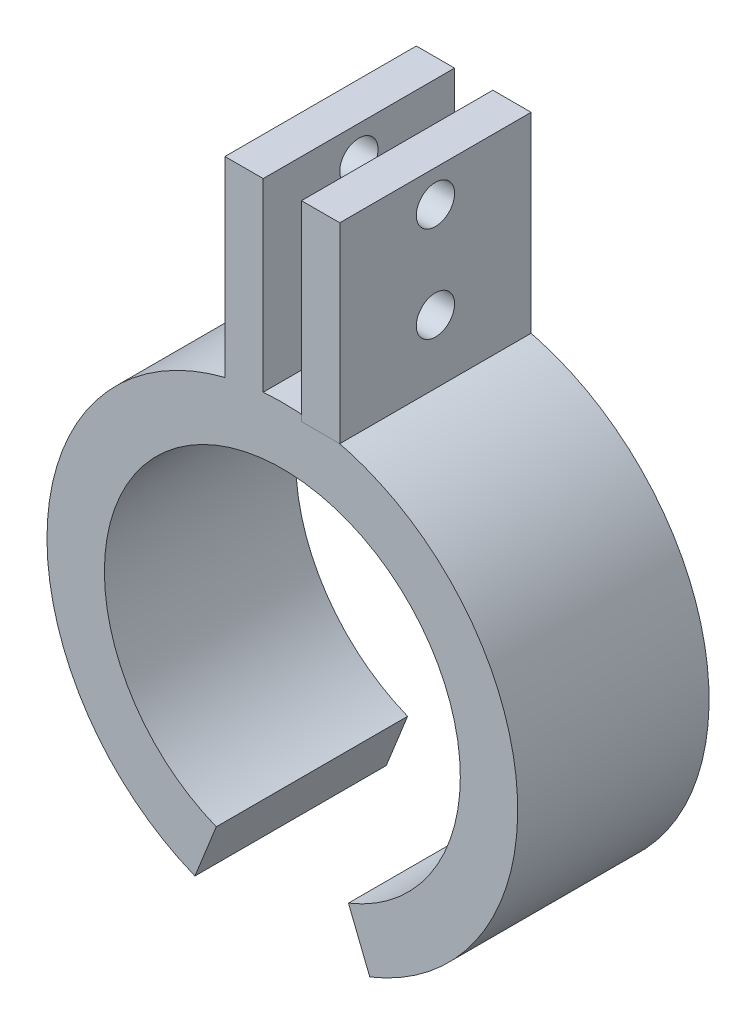
ISO-10303-21;
HEADER;
FILE_DESCRIPTION(('STEP AP214'),'2;1');
FILE_NAME('part.step','',(''),(''),'','','');
FILE_SCHEMA(('AUTOMOTIVE_DESIGN { 1 0 10303 214 1 1 1 1 }'));
ENDSEC;
DATA;
#1=APPLICATION_CONTEXT('core data for automotive mechanical design processes');
#2=APPLICATION_PROTOCOL_DEFINITION('international standard','automotive_design',2000,#1);
#3=PRODUCT_CONTEXT('',#1,'mechanical');
#4=PRODUCT('Part','Part','',(#3));
#5=PRODUCT_RELATED_PRODUCT_CATEGORY('part','',(#4));
#6=PRODUCT_DEFINITION_FORMATION('','',#4);
#7=PRODUCT_DEFINITION_CONTEXT('part definition',#1,'design');
#8=PRODUCT_DEFINITION('design','',#6,#7);
#9=PRODUCT_DEFINITION_SHAPE('','',#8);
#10=(LENGTH_UNIT() NAMED_UNIT(*) SI_UNIT(.MILLI.,.METRE.));
#11=(NAMED_UNIT(*) PLANE_ANGLE_UNIT() SI_UNIT($,.RADIAN.));
#12=(NAMED_UNIT(*) SI_UNIT($,.STERADIAN.) SOLID_ANGLE_UNIT());
#13=UNCERTAINTY_MEASURE_WITH_UNIT(LENGTH_MEASURE(1.E-05),#10,'distance_accuracy_value','');
#14=(GEOMETRIC_REPRESENTATION_CONTEXT(3) GLOBAL_UNCERTAINTY_ASSIGNED_CONTEXT((#13)) GLOBAL_UNIT_ASSIGNED_CONTEXT((#10,
#11,#12)) REPRESENTATION_CONTEXT('',''));
#15=CARTESIAN_POINT('',(0.,0.,0.));
#16=DIRECTION('',(0.,0.,1.));
#17=DIRECTION('',(1.,0.,0.));
#18=AXIS2_PLACEMENT_3D('',#15,#16,#17);
#19=CARTESIAN_POINT('',(3.,11.9285372112426,10.));
#20=DIRECTION('',(-1.,0.,0.));
#21=DIRECTION('',(0.,0.,1.));
#22=AXIS2_PLACEMENT_3D('',#19,#20,#21);
#23=PLANE('',#22);
#24=CARTESIAN_POINT('',(3.,20.259282197584,5.));
#25=DIRECTION('',(-1.,0.,0.));
#26=DIRECTION('',(0.,0.,1.));
#27=AXIS2_PLACEMENT_3D('',#24,#25,#26);
#28=CIRCLE('',#27,1.);
#29=CARTESIAN_POINT('',(3.,20.259282197584,6.));
#30=VERTEX_POINT('',#29);
#31=EDGE_CURVE('E117',#30,#30,#28,.T.);
#32=ORIENTED_EDGE('',*,*,#31,.T.);
#33=EDGE_LOOP('',(#32));
#34=FACE_BOUND('',#33,.T.);
#35=CARTESIAN_POINT('',(3.,15.259282197584,5.));
#36=DIRECTION('',(-1.,0.,0.));
#37=DIRECTION('',(0.,0.,1.));
#38=AXIS2_PLACEMENT_3D('',#35,#36,#37);
#39=CIRCLE('',#38,1.);
#40=CARTESIAN_POINT('',(3.,15.259282197584,6.));
#41=VERTEX_POINT('',#40);
#42=EDGE_CURVE('E127',#41,#41,#39,.T.);
#43=ORIENTED_EDGE('',*,*,#42,.T.);
#44=EDGE_LOOP('',(#43));
#45=FACE_BOUND('',#44,.T.);
#46=DIRECTION('',(0.,1.,0.));
#47=VECTOR('',#46,1.);
#48=CARTESIAN_POINT('',(3.,11.9285372112426,0.));
#49=LINE('',#48,#47);
#50=CARTESIAN_POINT('',(3.,11.9285372112426,0.));
#51=VERTEX_POINT('',#50);
#52=CARTESIAN_POINT('',(3.,21.9285372112426,0.));
#53=VERTEX_POINT('',#52);
#54=EDGE_CURVE('E115',#51,#53,#49,.T.);
#55=ORIENTED_EDGE('',*,*,#54,.T.);
#56=DIRECTION('',(0.,0.,-1.));
#57=VECTOR('',#56,1.);
#58=CARTESIAN_POINT('',(3.,21.9285372112426,10.));
#59=LINE('',#58,#57);
#60=CARTESIAN_POINT('',(3.,21.9285372112426,10.));
#61=VERTEX_POINT('',#60);
#62=EDGE_CURVE('E12',#61,#53,#59,.T.);
#63=ORIENTED_EDGE('',*,*,#62,.F.);
#64=DIRECTION('',(0.,1.,0.));
#65=VECTOR('',#64,1.);
#66=CARTESIAN_POINT('',(3.,11.9285372112426,10.));
#67=LINE('',#66,#65);
#68=CARTESIAN_POINT('',(3.,11.9285372112426,10.));
#69=VERTEX_POINT('',#68);
#70=EDGE_CURVE('E91',#69,#61,#67,.T.);
#71=ORIENTED_EDGE('',*,*,#70,.F.);
#72=DIRECTION('',(0.,0.,-1.));
#73=VECTOR('',#72,1.);
#74=CARTESIAN_POINT('',(3.,11.9285372112426,10.));
#75=LINE('',#74,#73);
#76=EDGE_CURVE('E67',#69,#51,#75,.T.);
#77=ORIENTED_EDGE('',*,*,#76,.T.);
#78=EDGE_LOOP('',(#55,#63,#71,#77));
#79=FACE_BOUND('',#78,.T.);
#80=ADVANCED_FACE('F49',(#34,#45,#79),#23,.F.);
#81=CARTESIAN_POINT('',(1.,21.9285372112426,10.));
#82=DIRECTION('',(0.,1.,0.));
#83=DIRECTION('',(0.,0.,1.));
#84=AXIS2_PLACEMENT_3D('',#81,#82,#83);
#85=PLANE('',#84);
#86=DIRECTION('',(1.,0.,0.));
#87=VECTOR('',#86,1.);
#88=CARTESIAN_POINT('',(1.,21.9285372112426,0.));
#89=LINE('',#88,#87);
#90=CARTESIAN_POINT('',(1.,21.9285372112426,0.));
#91=VERTEX_POINT('',#90);
#92=EDGE_CURVE('E100',#91,#53,#89,.T.);
#93=ORIENTED_EDGE('',*,*,#92,.F.);
#94=DIRECTION('',(0.,0.,-1.));
#95=VECTOR('',#94,1.);
#96=CARTESIAN_POINT('',(1.,21.9285372112426,10.));
#97=LINE('',#96,#95);
#98=CARTESIAN_POINT('',(1.,21.9285372112426,10.));
#99=VERTEX_POINT('',#98);
#100=EDGE_CURVE('E58',#99,#91,#97,.T.);
#101=ORIENTED_EDGE('',*,*,#100,.F.);
#102=DIRECTION('',(1.,0.,0.));
#103=VECTOR('',#102,1.);
#104=CARTESIAN_POINT('',(1.,21.9285372112426,10.));
#105=LINE('',#104,#103);
#106=EDGE_CURVE('E98',#99,#61,#105,.T.);
#107=ORIENTED_EDGE('',*,*,#106,.T.);
#108=ORIENTED_EDGE('',*,*,#62,.T.);
#109=EDGE_LOOP('',(#93,#101,#107,#108));
#110=FACE_BOUND('',#109,.T.);
#111=ADVANCED_FACE('F97',(#110),#85,.T.);
#112=CARTESIAN_POINT('',(1.,11.9285372112426,10.));
#113=DIRECTION('',(-1.,0.,0.));
#114=DIRECTION('',(0.,0.,1.));
#115=AXIS2_PLACEMENT_3D('',#112,#113,#114);
#116=PLANE('',#115);
#117=CARTESIAN_POINT('',(1.,20.259282197584,5.));
#118=DIRECTION('',(-1.,0.,0.));
#119=DIRECTION('',(0.,0.,1.));
#120=AXIS2_PLACEMENT_3D('',#117,#118,#119);
#121=CIRCLE('',#120,1.);
#122=CARTESIAN_POINT('',(1.,20.259282197584,6.));
#123=VERTEX_POINT('',#122);
#124=EDGE_CURVE('E52',#123,#123,#121,.T.);
#125=ORIENTED_EDGE('',*,*,#124,.F.);
#126=EDGE_LOOP('',(#125));
#127=FACE_BOUND('',#126,.T.);
#128=CARTESIAN_POINT('',(1.,15.259282197584,5.));
#129=DIRECTION('',(-1.,0.,0.));
#130=DIRECTION('',(0.,0.,1.));
#131=AXIS2_PLACEMENT_3D('',#128,#129,#130);
#132=CIRCLE('',#131,1.);
#133=CARTESIAN_POINT('',(1.,15.259282197584,6.));
#134=VERTEX_POINT('',#133);
#135=EDGE_CURVE('E125',#134,#134,#132,.T.);
#136=ORIENTED_EDGE('',*,*,#135,.F.);
#137=EDGE_LOOP('',(#136));
#138=FACE_BOUND('',#137,.T.);
#139=DIRECTION('',(0.,1.,0.));
#140=VECTOR('',#139,1.);
#141=CARTESIAN_POINT('',(1.,11.9285372112426,0.));
#142=LINE('',#141,#140);
#143=CARTESIAN_POINT('',(1.,11.9285372112426,0.));
#144=VERTEX_POINT('',#143);
#145=EDGE_CURVE('E119',#144,#91,#142,.T.);
#146=ORIENTED_EDGE('',*,*,#145,.F.);
#147=DIRECTION('',(0.,0.,-1.));
#148=VECTOR('',#147,1.);
#149=CARTESIAN_POINT('',(1.,11.9285372112426,10.));
#150=LINE('',#149,#148);
#151=CARTESIAN_POINT('',(1.,11.9285372112426,10.));
#152=VERTEX_POINT('',#151);
#153=EDGE_CURVE('E80',#152,#144,#150,.T.);
#154=ORIENTED_EDGE('',*,*,#153,.F.);
#155=DIRECTION('',(0.,1.,0.));
#156=VECTOR('',#155,1.);
#157=CARTESIAN_POINT('',(1.,11.9285372112426,10.));
#158=LINE('',#157,#156);
#159=EDGE_CURVE('E107',#152,#99,#158,.T.);
#160=ORIENTED_EDGE('',*,*,#159,.T.);
#161=ORIENTED_EDGE('',*,*,#100,.T.);
#162=EDGE_LOOP('',(#146,#154,#160,#161));
#163=FACE_BOUND('',#162,.T.);
#164=ADVANCED_FACE('F109',(#127,#138,#163),#116,.T.);
#165=CARTESIAN_POINT('',(3.,11.9285372112426,10.));
#166=DIRECTION('',(0.,-1.,0.));
#167=DIRECTION('',(0.,0.,-1.));
#168=AXIS2_PLACEMENT_3D('',#165,#166,#167);
#169=PLANE('',#168);
#170=DIRECTION('',(-1.,0.,0.));
#171=VECTOR('',#170,1.);
#172=CARTESIAN_POINT('',(3.,11.9285372112426,0.));
#173=LINE('',#172,#171);
#174=EDGE_CURVE('E121',#51,#144,#173,.T.);
#175=ORIENTED_EDGE('',*,*,#174,.F.);
#176=ORIENTED_EDGE('',*,*,#76,.F.);
#177=DIRECTION('',(-1.,0.,0.));
#178=VECTOR('',#177,1.);
#179=CARTESIAN_POINT('',(3.,11.9285372112426,10.));
#180=LINE('',#179,#178);
#181=EDGE_CURVE('E110',#69,#152,#180,.T.);
#182=ORIENTED_EDGE('',*,*,#181,.T.);
#183=ORIENTED_EDGE('',*,*,#153,.T.);
#184=EDGE_LOOP('',(#175,#176,#182,#183));
#185=FACE_BOUND('',#184,.T.);
#186=ADVANCED_FACE('F157',(#185),#169,.T.);
#187=CARTESIAN_POINT('',(0.,0.,10.));
#188=DIRECTION('',(0.,0.,-1.));
#189=DIRECTION('',(-1.,0.,0.));
#190=AXIS2_PLACEMENT_3D('',#187,#188,#189);
#191=PLANE('',#190);
#192=ORIENTED_EDGE('',*,*,#70,.T.);
#193=ORIENTED_EDGE('',*,*,#106,.F.);
#194=ORIENTED_EDGE('',*,*,#159,.F.);
#195=ORIENTED_EDGE('',*,*,#181,.F.);
#196=EDGE_LOOP('',(#192,#193,#194,#195));
#197=FACE_BOUND('',#196,.T.);
#198=ADVANCED_FACE('F106',(#197),#191,.F.);
#199=CARTESIAN_POINT('',(0.,0.,0.));
#200=DIRECTION('',(0.,0.,-1.));
#201=DIRECTION('',(-1.,0.,0.));
#202=AXIS2_PLACEMENT_3D('',#199,#200,#201);
#203=PLANE('',#202);
#204=ORIENTED_EDGE('',*,*,#54,.F.);
#205=ORIENTED_EDGE('',*,*,#174,.T.);
#206=ORIENTED_EDGE('',*,*,#145,.T.);
#207=ORIENTED_EDGE('',*,*,#92,.T.);
#208=EDGE_LOOP('',(#204,#205,#206,#207));
#209=FACE_BOUND('',#208,.T.);
#210=ADVANCED_FACE('F148',(#209),#203,.T.);
#211=CARTESIAN_POINT('',(12.3,15.259282197584,5.));
#212=DIRECTION('',(-1.,0.,0.));
#213=DIRECTION('',(0.,0.,1.));
#214=AXIS2_PLACEMENT_3D('',#211,#212,#213);
#215=CYLINDRICAL_SURFACE('',#214,1.);
#216=ORIENTED_EDGE('',*,*,#135,.T.);
#217=EDGE_LOOP('',(#216));
#218=FACE_BOUND('',#217,.T.);
#219=ORIENTED_EDGE('',*,*,#42,.F.);
#220=EDGE_LOOP('',(#219));
#221=FACE_BOUND('',#220,.T.);
#222=ADVANCED_FACE('F142',(#218,#221),#215,.F.);
#223=CARTESIAN_POINT('',(12.3,20.259282197584,5.));
#224=DIRECTION('',(-1.,0.,0.));
#225=DIRECTION('',(0.,0.,1.));
#226=AXIS2_PLACEMENT_3D('',#223,#224,#225);
#227=CYLINDRICAL_SURFACE('',#226,1.);
#228=ORIENTED_EDGE('',*,*,#124,.T.);
#229=EDGE_LOOP('',(#228));
#230=FACE_BOUND('',#229,.T.);
#231=ORIENTED_EDGE('',*,*,#31,.F.);
#232=EDGE_LOOP('',(#231));
#233=FACE_BOUND('',#232,.T.);
#234=ADVANCED_FACE('F140',(#230,#233),#227,.F.);
#235=CLOSED_SHELL('',(#80,#111,#164,#186,#198,#210,#222,#234));
#236=MANIFOLD_SOLID_BREP('B2',#235);
#237=CARTESIAN_POINT('',(0.,0.,10.));
#238=DIRECTION('',(0.,0.,-1.));
#239=DIRECTION('',(-1.,0.,0.));
#240=AXIS2_PLACEMENT_3D('',#237,#238,#239);
#241=CYLINDRICAL_SURFACE('',#240,12.3);
#242=DIRECTION('',(0.,0.,1.));
#243=VECTOR('',#242,1.);
#244=CARTESIAN_POINT('',(-3.,11.9285372112426,0.));
#245=LINE('',#244,#243);
#246=CARTESIAN_POINT('',(-3.,11.9285372112426,0.));
#247=VERTEX_POINT('',#246);
#248=CARTESIAN_POINT('',(-3.,11.9285372112426,10.));
#249=VERTEX_POINT('',#248);
#250=EDGE_CURVE('E319',#247,#249,#245,.T.);
#251=ORIENTED_EDGE('',*,*,#250,.F.);
#252=CARTESIAN_POINT('',(0.,0.,0.));
#253=DIRECTION('',(0.,0.,1.));
#254=DIRECTION('',(1.,0.,0.));
#255=AXIS2_PLACEMENT_3D('',#252,#253,#254);
#256=CIRCLE('',#255,12.3);
#257=CARTESIAN_POINT('',(-4.56810531915548,-11.4202632978887,0.));
#258=VERTEX_POINT('',#257);
#259=EDGE_CURVE('E326',#247,#258,#256,.T.);
#260=ORIENTED_EDGE('',*,*,#259,.T.);
#261=DIRECTION('',(0.,0.,-1.));
#262=VECTOR('',#261,1.);
#263=CARTESIAN_POINT('',(-4.56810531915548,-11.4202632978887,10.));
#264=LINE('',#263,#262);
#265=CARTESIAN_POINT('',(-4.56810531915548,-11.4202632978887,10.));
#266=VERTEX_POINT('',#265);
#267=EDGE_CURVE('E47',#266,#258,#264,.T.);
#268=ORIENTED_EDGE('',*,*,#267,.F.);
#269=CARTESIAN_POINT('',(0.,0.,10.));
#270=DIRECTION('',(0.,0.,1.));
#271=DIRECTION('',(1.,0.,0.));
#272=AXIS2_PLACEMENT_3D('',#269,#270,#271);
#273=CIRCLE('',#272,12.3);
#274=EDGE_CURVE('E266',#249,#266,#273,.T.);
#275=ORIENTED_EDGE('',*,*,#274,.F.);
#276=EDGE_LOOP('',(#251,#260,#268,#275));
#277=FACE_BOUND('',#276,.T.);
#278=ADVANCED_FACE('F215',(#277),#241,.T.);
#279=CARTESIAN_POINT('',(4.56810531915547,-11.4202632978887,0.));
#280=VERTEX_POINT('',#279);
#281=CARTESIAN_POINT('',(-1.,12.259282197584,0.));
#282=VERTEX_POINT('',#281);
#283=EDGE_CURVE('E342',#280,#282,#256,.T.);
#284=ORIENTED_EDGE('',*,*,#283,.T.);
#285=DIRECTION('',(0.,0.,-1.));
#286=VECTOR('',#285,1.);
#287=CARTESIAN_POINT('',(-1.,12.259282197584,10.));
#288=LINE('',#287,#286);
#289=CARTESIAN_POINT('',(-1.,12.259282197584,10.));
#290=VERTEX_POINT('',#289);
#291=EDGE_CURVE('E298',#282,#290,#288,.F.);
#292=ORIENTED_EDGE('',*,*,#291,.T.);
#293=CARTESIAN_POINT('',(4.56810531915547,-11.4202632978887,10.));
#294=VERTEX_POINT('',#293);
#295=EDGE_CURVE('E327',#294,#290,#273,.T.);
#296=ORIENTED_EDGE('',*,*,#295,.F.);
#297=DIRECTION('',(0.,0.,-1.));
#298=VECTOR('',#297,1.);
#299=CARTESIAN_POINT('',(4.56810531915547,-11.4202632978887,10.));
#300=LINE('',#299,#298);
#301=EDGE_CURVE('E242',#294,#280,#300,.T.);
#302=ORIENTED_EDGE('',*,*,#301,.T.);
#303=EDGE_LOOP('',(#284,#292,#296,#302));
#304=FACE_BOUND('',#303,.T.);
#305=ADVANCED_FACE('F217',(#304),#241,.T.);
#306=CARTESIAN_POINT('',(-3.45393329009317,-8.63483322523291,10.));
#307=DIRECTION('',(0.928476690885259,-0.371390676354104,0.));
#308=DIRECTION('',(0.371390676354104,0.928476690885259,0.));
#309=AXIS2_PLACEMENT_3D('',#306,#307,#308);
#310=PLANE('',#309);
#311=DIRECTION('',(-0.371390676354104,-0.928476690885259,0.));
#312=VECTOR('',#311,1.);
#313=CARTESIAN_POINT('',(-3.45393329009317,-8.63483322523291,0.));
#314=LINE('',#313,#312);
#315=CARTESIAN_POINT('',(-3.45393329009317,-8.63483322523291,0.));
#316=VERTEX_POINT('',#315);
#317=EDGE_CURVE('E345',#316,#258,#314,.T.);
#318=ORIENTED_EDGE('',*,*,#317,.F.);
#319=DIRECTION('',(0.,0.,-1.));
#320=VECTOR('',#319,1.);
#321=CARTESIAN_POINT('',(-3.45393329009317,-8.63483322523291,10.));
#322=LINE('',#321,#320);
#323=CARTESIAN_POINT('',(-3.45393329009317,-8.63483322523291,10.));
#324=VERTEX_POINT('',#323);
#325=EDGE_CURVE('E225',#324,#316,#322,.T.);
#326=ORIENTED_EDGE('',*,*,#325,.F.);
#327=DIRECTION('',(-0.371390676354104,-0.928476690885259,0.));
#328=VECTOR('',#327,1.);
#329=CARTESIAN_POINT('',(-3.45393329009317,-8.63483322523291,10.));
#330=LINE('',#329,#328);
#331=EDGE_CURVE('E331',#324,#266,#330,.T.);
#332=ORIENTED_EDGE('',*,*,#331,.T.);
#333=ORIENTED_EDGE('',*,*,#267,.T.);
#334=EDGE_LOOP('',(#318,#326,#332,#333));
#335=FACE_BOUND('',#334,.T.);
#336=ADVANCED_FACE('F396',(#335),#310,.T.);
#337=CARTESIAN_POINT('',(0.,0.,10.));
#338=DIRECTION('',(0.,0.,-1.));
#339=DIRECTION('',(-1.,0.,0.));
#340=AXIS2_PLACEMENT_3D('',#337,#338,#339);
#341=CYLINDRICAL_SURFACE('',#340,9.3);
#342=CARTESIAN_POINT('',(0.,0.,0.));
#343=DIRECTION('',(0.,0.,1.));
#344=DIRECTION('',(1.,0.,0.));
#345=AXIS2_PLACEMENT_3D('',#342,#343,#344);
#346=CIRCLE('',#345,9.3);
#347=CARTESIAN_POINT('',(3.45393329009316,-8.63483322523291,0.));
#348=VERTEX_POINT('',#347);
#349=EDGE_CURVE('E349',#348,#316,#346,.T.);
#350=ORIENTED_EDGE('',*,*,#349,.F.);
#351=DIRECTION('',(0.,0.,-1.));
#352=VECTOR('',#351,1.);
#353=CARTESIAN_POINT('',(3.45393329009316,-8.63483322523291,10.));
#354=LINE('',#353,#352);
#355=CARTESIAN_POINT('',(3.45393329009316,-8.63483322523291,10.));
#356=VERTEX_POINT('',#355);
#357=EDGE_CURVE('E359',#356,#348,#354,.T.);
#358=ORIENTED_EDGE('',*,*,#357,.F.);
#359=CARTESIAN_POINT('',(0.,0.,10.));
#360=DIRECTION('',(0.,0.,1.));
#361=DIRECTION('',(1.,0.,0.));
#362=AXIS2_PLACEMENT_3D('',#359,#360,#361);
#363=CIRCLE('',#362,9.3);
#364=EDGE_CURVE('E335',#356,#324,#363,.T.);
#365=ORIENTED_EDGE('',*,*,#364,.T.);
#366=ORIENTED_EDGE('',*,*,#325,.T.);
#367=EDGE_LOOP('',(#350,#358,#365,#366));
#368=FACE_BOUND('',#367,.T.);
#369=ADVANCED_FACE('F399',(#368),#341,.F.);
#370=CARTESIAN_POINT('',(4.56810531915547,-11.4202632978887,10.));
#371=DIRECTION('',(-0.928476690885259,-0.371390676354103,0.));
#372=DIRECTION('',(0.371390676354103,-0.928476690885259,0.));
#373=AXIS2_PLACEMENT_3D('',#370,#371,#372);
#374=PLANE('',#373);
#375=DIRECTION('',(-0.371390676354103,0.928476690885259,0.));
#376=VECTOR('',#375,1.);
#377=CARTESIAN_POINT('',(4.56810531915547,-11.4202632978887,0.));
#378=LINE('',#377,#376);
#379=EDGE_CURVE('E353',#280,#348,#378,.T.);
#380=ORIENTED_EDGE('',*,*,#379,.F.);
#381=ORIENTED_EDGE('',*,*,#301,.F.);
#382=DIRECTION('',(-0.371390676354103,0.928476690885259,0.));
#383=VECTOR('',#382,1.);
#384=CARTESIAN_POINT('',(4.56810531915547,-11.4202632978887,10.));
#385=LINE('',#384,#383);
#386=EDGE_CURVE('E339',#294,#356,#385,.T.);
#387=ORIENTED_EDGE('',*,*,#386,.T.);
#388=ORIENTED_EDGE('',*,*,#357,.T.);
#389=EDGE_LOOP('',(#380,#381,#387,#388));
#390=FACE_BOUND('',#389,.T.);
#391=ADVANCED_FACE('F403',(#390),#374,.T.);
#392=CARTESIAN_POINT('',(0.,0.,10.));
#393=DIRECTION('',(0.,0.,1.));
#394=DIRECTION('',(1.,0.,0.));
#395=AXIS2_PLACEMENT_3D('',#392,#393,#394);
#396=PLANE('',#395);
#397=ORIENTED_EDGE('',*,*,#295,.T.);
#398=DIRECTION('',(0.,1.,0.));
#399=VECTOR('',#398,1.);
#400=CARTESIAN_POINT('',(-1.,11.9285372112426,10.));
#401=LINE('',#400,#399);
#402=CARTESIAN_POINT('',(-1.,21.9285372112426,10.));
#403=VERTEX_POINT('',#402);
#404=EDGE_CURVE('E380',#290,#403,#401,.T.);
#405=ORIENTED_EDGE('',*,*,#404,.T.);
#406=DIRECTION('',(1.,0.,0.));
#407=VECTOR('',#406,1.);
#408=CARTESIAN_POINT('',(-3.,21.9285372112426,10.));
#409=LINE('',#408,#407);
#410=CARTESIAN_POINT('',(-3.,21.9285372112426,10.));
#411=VERTEX_POINT('',#410);
#412=EDGE_CURVE('E313',#411,#403,#409,.T.);
#413=ORIENTED_EDGE('',*,*,#412,.F.);
#414=DIRECTION('',(0.,1.,0.));
#415=VECTOR('',#414,1.);
#416=CARTESIAN_POINT('',(-3.,11.9285372112426,10.));
#417=LINE('',#416,#415);
#418=EDGE_CURVE('E233',#249,#411,#417,.T.);
#419=ORIENTED_EDGE('',*,*,#418,.F.);
#420=ORIENTED_EDGE('',*,*,#274,.T.);
#421=ORIENTED_EDGE('',*,*,#331,.F.);
#422=ORIENTED_EDGE('',*,*,#364,.F.);
#423=ORIENTED_EDGE('',*,*,#386,.F.);
#424=EDGE_LOOP('',(#397,#405,#413,#419,#420,#421,#422,#423));
#425=FACE_BOUND('',#424,.T.);
#426=ADVANCED_FACE('F401',(#425),#396,.T.);
#427=CARTESIAN_POINT('',(0.,0.,0.));
#428=DIRECTION('',(0.,0.,1.));
#429=DIRECTION('',(1.,0.,0.));
#430=AXIS2_PLACEMENT_3D('',#427,#428,#429);
#431=PLANE('',#430);
#432=ORIENTED_EDGE('',*,*,#259,.F.);
#433=DIRECTION('',(0.,1.,0.));
#434=VECTOR('',#433,1.);
#435=CARTESIAN_POINT('',(-3.,11.9285372112426,0.));
#436=LINE('',#435,#434);
#437=CARTESIAN_POINT('',(-3.,21.9285372112426,0.));
#438=VERTEX_POINT('',#437);
#439=EDGE_CURVE('E306',#247,#438,#436,.T.);
#440=ORIENTED_EDGE('',*,*,#439,.T.);
#441=DIRECTION('',(1.,0.,0.));
#442=VECTOR('',#441,1.);
#443=CARTESIAN_POINT('',(-3.,21.9285372112426,0.));
#444=LINE('',#443,#442);
#445=CARTESIAN_POINT('',(-1.,21.9285372112426,0.));
#446=VERTEX_POINT('',#445);
#447=EDGE_CURVE('E301',#438,#446,#444,.T.);
#448=ORIENTED_EDGE('',*,*,#447,.T.);
#449=DIRECTION('',(0.,1.,0.));
#450=VECTOR('',#449,1.);
#451=CARTESIAN_POINT('',(-1.,11.9285372112426,0.));
#452=LINE('',#451,#450);
#453=EDGE_CURVE('E291',#282,#446,#452,.T.);
#454=ORIENTED_EDGE('',*,*,#453,.F.);
#455=ORIENTED_EDGE('',*,*,#283,.F.);
#456=ORIENTED_EDGE('',*,*,#379,.T.);
#457=ORIENTED_EDGE('',*,*,#349,.T.);
#458=ORIENTED_EDGE('',*,*,#317,.T.);
#459=EDGE_LOOP('',(#432,#440,#448,#454,#455,#456,#457,#458));
#460=FACE_BOUND('',#459,.T.);
#461=ADVANCED_FACE('F305',(#460),#431,.F.);
#462=CARTESIAN_POINT('',(-1.,11.9285372112426,0.));
#463=DIRECTION('',(1.,0.,0.));
#464=DIRECTION('',(0.,0.,-1.));
#465=AXIS2_PLACEMENT_3D('',#462,#463,#464);
#466=PLANE('',#465);
#467=CARTESIAN_POINT('',(-1.,20.259282197584,5.));
#468=DIRECTION('',(1.,0.,0.));
#469=DIRECTION('',(0.,0.,-1.));
#470=AXIS2_PLACEMENT_3D('',#467,#468,#469);
#471=CIRCLE('',#470,1.);
#472=CARTESIAN_POINT('',(-1.,20.259282197584,4.));
#473=VERTEX_POINT('',#472);
#474=EDGE_CURVE('E376',#473,#473,#471,.T.);
#475=ORIENTED_EDGE('',*,*,#474,.F.);
#476=EDGE_LOOP('',(#475));
#477=FACE_BOUND('',#476,.T.);
#478=CARTESIAN_POINT('',(-1.,15.259282197584,5.));
#479=DIRECTION('',(1.,0.,0.));
#480=DIRECTION('',(0.,0.,-1.));
#481=AXIS2_PLACEMENT_3D('',#478,#479,#480);
#482=CIRCLE('',#481,1.);
#483=CARTESIAN_POINT('',(-1.,15.259282197584,4.));
#484=VERTEX_POINT('',#483);
#485=EDGE_CURVE('E366',#484,#484,#482,.T.);
#486=ORIENTED_EDGE('',*,*,#485,.F.);
#487=EDGE_LOOP('',(#486));
#488=FACE_BOUND('',#487,.T.);
#489=ORIENTED_EDGE('',*,*,#291,.F.);
#490=ORIENTED_EDGE('',*,*,#453,.T.);
#491=DIRECTION('',(0.,0.,1.));
#492=VECTOR('',#491,1.);
#493=CARTESIAN_POINT('',(-1.,21.9285372112426,0.));
#494=LINE('',#493,#492);
#495=EDGE_CURVE('E295',#446,#403,#494,.T.);
#496=ORIENTED_EDGE('',*,*,#495,.T.);
#497=ORIENTED_EDGE('',*,*,#404,.F.);
#498=EDGE_LOOP('',(#489,#490,#496,#497));
#499=FACE_BOUND('',#498,.T.);
#500=ADVANCED_FACE('F293',(#477,#488,#499),#466,.T.);
#501=CARTESIAN_POINT('',(-3.,11.9285372112426,0.));
#502=DIRECTION('',(1.,0.,0.));
#503=DIRECTION('',(0.,0.,-1.));
#504=AXIS2_PLACEMENT_3D('',#501,#502,#503);
#505=PLANE('',#504);
#506=CARTESIAN_POINT('',(-3.,20.259282197584,5.));
#507=DIRECTION('',(1.,0.,0.));
#508=DIRECTION('',(0.,0.,-1.));
#509=AXIS2_PLACEMENT_3D('',#506,#507,#508);
#510=CIRCLE('',#509,1.);
#511=CARTESIAN_POINT('',(-3.,20.259282197584,4.));
#512=VERTEX_POINT('',#511);
#513=EDGE_CURVE('E219',#512,#512,#510,.T.);
#514=ORIENTED_EDGE('',*,*,#513,.T.);
#515=EDGE_LOOP('',(#514));
#516=FACE_BOUND('',#515,.T.);
#517=CARTESIAN_POINT('',(-3.,15.259282197584,5.));
#518=DIRECTION('',(1.,0.,0.));
#519=DIRECTION('',(0.,0.,-1.));
#520=AXIS2_PLACEMENT_3D('',#517,#518,#519);
#521=CIRCLE('',#520,1.);
#522=CARTESIAN_POINT('',(-3.,15.259282197584,4.));
#523=VERTEX_POINT('',#522);
#524=EDGE_CURVE('E363',#523,#523,#521,.T.);
#525=ORIENTED_EDGE('',*,*,#524,.T.);
#526=EDGE_LOOP('',(#525));
#527=FACE_BOUND('',#526,.T.);
#528=ORIENTED_EDGE('',*,*,#418,.T.);
#529=DIRECTION('',(0.,0.,1.));
#530=VECTOR('',#529,1.);
#531=CARTESIAN_POINT('',(-3.,21.9285372112426,0.));
#532=LINE('',#531,#530);
#533=EDGE_CURVE('E315',#438,#411,#532,.T.);
#534=ORIENTED_EDGE('',*,*,#533,.F.);
#535=ORIENTED_EDGE('',*,*,#439,.F.);
#536=ORIENTED_EDGE('',*,*,#250,.T.);
#537=EDGE_LOOP('',(#528,#534,#535,#536));
#538=FACE_BOUND('',#537,.T.);
#539=ADVANCED_FACE('F390',(#516,#527,#538),#505,.F.);
#540=CARTESIAN_POINT('',(-3.,21.9285372112426,0.));
#541=DIRECTION('',(0.,-1.,0.));
#542=DIRECTION('',(0.,0.,-1.));
#543=AXIS2_PLACEMENT_3D('',#540,#541,#542);
#544=PLANE('',#543);
#545=ORIENTED_EDGE('',*,*,#412,.T.);
#546=ORIENTED_EDGE('',*,*,#495,.F.);
#547=ORIENTED_EDGE('',*,*,#447,.F.);
#548=ORIENTED_EDGE('',*,*,#533,.T.);
#549=EDGE_LOOP('',(#545,#546,#547,#548));
#550=FACE_BOUND('',#549,.T.);
#551=ADVANCED_FACE('F312',(#550),#544,.F.);
#552=CARTESIAN_POINT('',(12.3,15.259282197584,5.));
#553=DIRECTION('',(-1.,0.,0.));
#554=DIRECTION('',(0.,0.,1.));
#555=AXIS2_PLACEMENT_3D('',#552,#553,#554);
#556=CYLINDRICAL_SURFACE('',#555,1.);
#557=ORIENTED_EDGE('',*,*,#485,.T.);
#558=EDGE_LOOP('',(#557));
#559=FACE_BOUND('',#558,.T.);
#560=ORIENTED_EDGE('',*,*,#524,.F.);
#561=EDGE_LOOP('',(#560));
#562=FACE_BOUND('',#561,.T.);
#563=ADVANCED_FACE('F464',(#559,#562),#556,.F.);
#564=CARTESIAN_POINT('',(12.3,20.259282197584,5.));
#565=DIRECTION('',(-1.,0.,0.));
#566=DIRECTION('',(0.,0.,1.));
#567=AXIS2_PLACEMENT_3D('',#564,#565,#566);
#568=CYLINDRICAL_SURFACE('',#567,1.);
#569=ORIENTED_EDGE('',*,*,#474,.T.);
#570=EDGE_LOOP('',(#569));
#571=FACE_BOUND('',#570,.T.);
#572=ORIENTED_EDGE('',*,*,#513,.F.);
#573=EDGE_LOOP('',(#572));
#574=FACE_BOUND('',#573,.T.);
#575=ADVANCED_FACE('F489',(#571,#574),#568,.F.);
#576=CLOSED_SHELL('',(#278,#305,#336,#369,#391,#426,#461,#500,#539,#551,#563,#575));
#577=MANIFOLD_SOLID_BREP('B6',#576);
#578=ADVANCED_BREP_SHAPE_REPRESENTATION('',(#18,#236,#577),#14);
#579=SHAPE_DEFINITION_REPRESENTATION(#9,#578);
ENDSEC;
END-ISO-10303-21;
